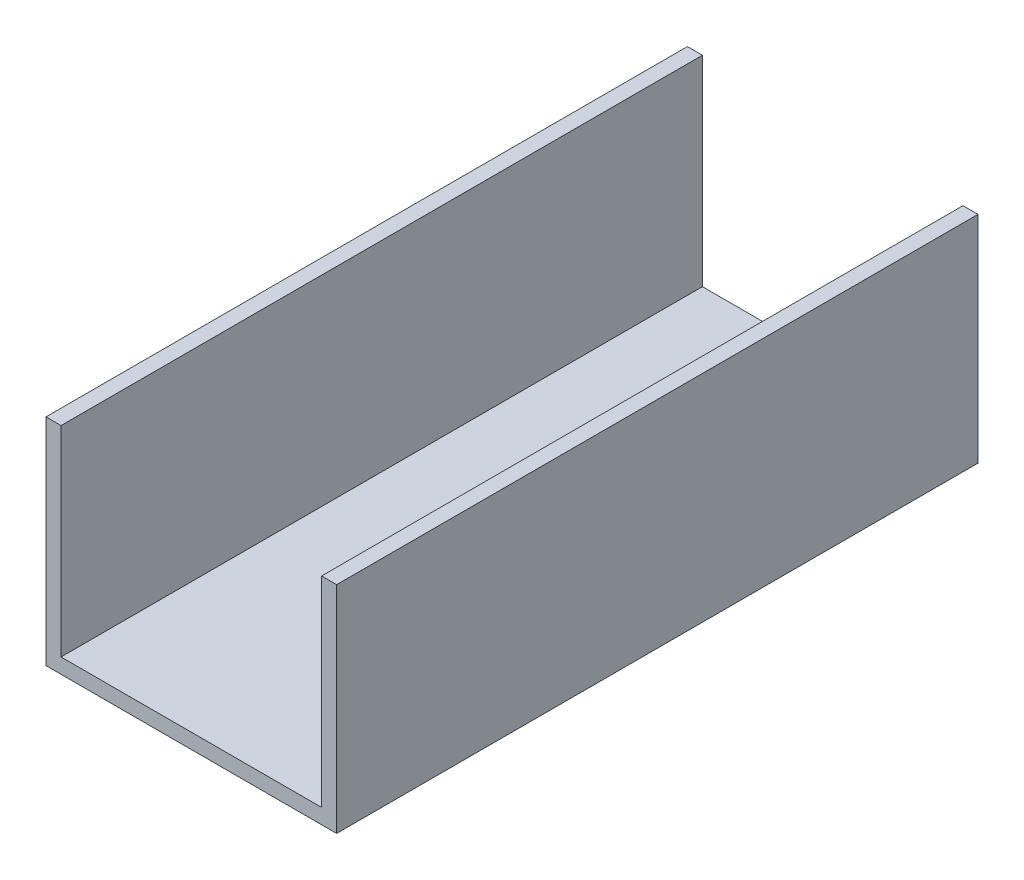
ISO-10303-21;
HEADER;
FILE_DESCRIPTION(('STEP AP214'),'2;1');
FILE_NAME('part.step','',(''),(''),'','','');
FILE_SCHEMA(('AUTOMOTIVE_DESIGN { 1 0 10303 214 1 1 1 1 }'));
ENDSEC;
DATA;
#1=APPLICATION_CONTEXT('core data for automotive mechanical design processes');
#2=APPLICATION_PROTOCOL_DEFINITION('international standard','automotive_design',2000,#1);
#3=PRODUCT_CONTEXT('',#1,'mechanical');
#4=PRODUCT('Part','Part','',(#3));
#5=PRODUCT_RELATED_PRODUCT_CATEGORY('part','',(#4));
#6=PRODUCT_DEFINITION_FORMATION('','',#4);
#7=PRODUCT_DEFINITION_CONTEXT('part definition',#1,'design');
#8=PRODUCT_DEFINITION('design','',#6,#7);
#9=PRODUCT_DEFINITION_SHAPE('','',#8);
#10=(LENGTH_UNIT() NAMED_UNIT(*) SI_UNIT(.MILLI.,.METRE.));
#11=(NAMED_UNIT(*) PLANE_ANGLE_UNIT() SI_UNIT($,.RADIAN.));
#12=(NAMED_UNIT(*) SI_UNIT($,.STERADIAN.) SOLID_ANGLE_UNIT());
#13=UNCERTAINTY_MEASURE_WITH_UNIT(LENGTH_MEASURE(1.E-05),#10,'distance_accuracy_value','');
#14=(GEOMETRIC_REPRESENTATION_CONTEXT(3) GLOBAL_UNCERTAINTY_ASSIGNED_CONTEXT((#13)) GLOBAL_UNIT_ASSIGNED_CONTEXT((#10,
#11,#12)) REPRESENTATION_CONTEXT('',''));
#15=CARTESIAN_POINT('',(0.,0.,0.));
#16=DIRECTION('',(0.,0.,1.));
#17=DIRECTION('',(1.,0.,0.));
#18=AXIS2_PLACEMENT_3D('',#15,#16,#17);
#19=CARTESIAN_POINT('',(0.,0.,203.2));
#20=DIRECTION('',(1.,0.,0.));
#21=DIRECTION('',(0.,1.,0.));
#22=AXIS2_PLACEMENT_3D('',#19,#20,#21);
#23=PLANE('',#22);
#24=DIRECTION('',(0.,-1.,0.));
#25=VECTOR('',#24,1.);
#26=CARTESIAN_POINT('',(0.,0.,0.));
#27=LINE('',#26,#25);
#28=CARTESIAN_POINT('',(0.,68.2625,0.));
#29=VERTEX_POINT('',#28);
#30=CARTESIAN_POINT('',(0.,0.,0.));
#31=VERTEX_POINT('',#30);
#32=EDGE_CURVE('E134',#29,#31,#27,.T.);
#33=ORIENTED_EDGE('',*,*,#32,.T.);
#34=DIRECTION('',(0.,0.,-1.));
#35=VECTOR('',#34,1.);
#36=CARTESIAN_POINT('',(0.,0.,203.2));
#37=LINE('',#36,#35);
#38=CARTESIAN_POINT('',(0.,0.,203.2));
#39=VERTEX_POINT('',#38);
#40=EDGE_CURVE('E11',#39,#31,#37,.T.);
#41=ORIENTED_EDGE('',*,*,#40,.F.);
#42=DIRECTION('',(0.,-1.,0.));
#43=VECTOR('',#42,1.);
#44=CARTESIAN_POINT('',(0.,0.,203.2));
#45=LINE('',#44,#43);
#46=CARTESIAN_POINT('',(0.,68.2625,203.2));
#47=VERTEX_POINT('',#46);
#48=EDGE_CURVE('E146',#47,#39,#45,.T.);
#49=ORIENTED_EDGE('',*,*,#48,.F.);
#50=DIRECTION('',(0.,0.,-1.));
#51=VECTOR('',#50,1.);
#52=CARTESIAN_POINT('',(0.,68.2625,203.2));
#53=LINE('',#52,#51);
#54=EDGE_CURVE('E131',#47,#29,#53,.T.);
#55=ORIENTED_EDGE('',*,*,#54,.T.);
#56=EDGE_LOOP('',(#33,#41,#49,#55));
#57=FACE_BOUND('',#56,.T.);
#58=ADVANCED_FACE('F39',(#57),#23,.F.);
#59=CARTESIAN_POINT('',(0.,0.,203.2));
#60=DIRECTION('',(0.,1.,0.));
#61=DIRECTION('',(0.,0.,1.));
#62=AXIS2_PLACEMENT_3D('',#59,#60,#61);
#63=PLANE('',#62);
#64=DIRECTION('',(1.,0.,0.));
#65=VECTOR('',#64,1.);
#66=CARTESIAN_POINT('',(0.,0.,0.));
#67=LINE('',#66,#65);
#68=CARTESIAN_POINT('',(92.075,0.,0.));
#69=VERTEX_POINT('',#68);
#70=EDGE_CURVE('E138',#31,#69,#67,.T.);
#71=ORIENTED_EDGE('',*,*,#70,.T.);
#72=DIRECTION('',(0.,0.,-1.));
#73=VECTOR('',#72,1.);
#74=CARTESIAN_POINT('',(92.075,0.,203.2));
#75=LINE('',#74,#73);
#76=CARTESIAN_POINT('',(92.075,0.,203.2));
#77=VERTEX_POINT('',#76);
#78=EDGE_CURVE('E50',#77,#69,#75,.T.);
#79=ORIENTED_EDGE('',*,*,#78,.F.);
#80=DIRECTION('',(1.,0.,0.));
#81=VECTOR('',#80,1.);
#82=CARTESIAN_POINT('',(0.,0.,203.2));
#83=LINE('',#82,#81);
#84=EDGE_CURVE('E97',#39,#77,#83,.T.);
#85=ORIENTED_EDGE('',*,*,#84,.F.);
#86=ORIENTED_EDGE('',*,*,#40,.T.);
#87=EDGE_LOOP('',(#71,#79,#85,#86));
#88=FACE_BOUND('',#87,.T.);
#89=ADVANCED_FACE('F182',(#88),#63,.F.);
#90=CARTESIAN_POINT('',(92.075,0.,203.2));
#91=DIRECTION('',(-1.,0.,0.));
#92=DIRECTION('',(0.,0.,1.));
#93=AXIS2_PLACEMENT_3D('',#90,#91,#92);
#94=PLANE('',#93);
#95=DIRECTION('',(0.,1.,0.));
#96=VECTOR('',#95,1.);
#97=CARTESIAN_POINT('',(92.075,0.,0.));
#98=LINE('',#97,#96);
#99=CARTESIAN_POINT('',(92.075,68.2625,0.));
#100=VERTEX_POINT('',#99);
#101=EDGE_CURVE('E139',#69,#100,#98,.T.);
#102=ORIENTED_EDGE('',*,*,#101,.T.);
#103=DIRECTION('',(0.,0.,-1.));
#104=VECTOR('',#103,1.);
#105=CARTESIAN_POINT('',(92.075,68.2625,203.2));
#106=LINE('',#105,#104);
#107=CARTESIAN_POINT('',(92.075,68.2625,203.2));
#108=VERTEX_POINT('',#107);
#109=EDGE_CURVE('E157',#108,#100,#106,.T.);
#110=ORIENTED_EDGE('',*,*,#109,.F.);
#111=DIRECTION('',(0.,1.,0.));
#112=VECTOR('',#111,1.);
#113=CARTESIAN_POINT('',(92.075,0.,203.2));
#114=LINE('',#113,#112);
#115=EDGE_CURVE('E163',#77,#108,#114,.T.);
#116=ORIENTED_EDGE('',*,*,#115,.F.);
#117=ORIENTED_EDGE('',*,*,#78,.T.);
#118=EDGE_LOOP('',(#102,#110,#116,#117));
#119=FACE_BOUND('',#118,.T.);
#120=ADVANCED_FACE('F162',(#119),#94,.F.);
#121=CARTESIAN_POINT('',(87.3125,68.2625,203.2));
#122=DIRECTION('',(0.,-1.,0.));
#123=DIRECTION('',(0.,0.,-1.));
#124=AXIS2_PLACEMENT_3D('',#121,#122,#123);
#125=PLANE('',#124);
#126=DIRECTION('',(-1.,0.,0.));
#127=VECTOR('',#126,1.);
#128=CARTESIAN_POINT('',(87.3125,68.2625,0.));
#129=LINE('',#128,#127);
#130=CARTESIAN_POINT('',(87.3125,68.2625,0.));
#131=VERTEX_POINT('',#130);
#132=EDGE_CURVE('E145',#100,#131,#129,.T.);
#133=ORIENTED_EDGE('',*,*,#132,.T.);
#134=DIRECTION('',(0.,0.,-1.));
#135=VECTOR('',#134,1.);
#136=CARTESIAN_POINT('',(87.3125,68.2625,203.2));
#137=LINE('',#136,#135);
#138=CARTESIAN_POINT('',(87.3125,68.2625,203.2));
#139=VERTEX_POINT('',#138);
#140=EDGE_CURVE('E154',#139,#131,#137,.T.);
#141=ORIENTED_EDGE('',*,*,#140,.F.);
#142=DIRECTION('',(-1.,0.,0.));
#143=VECTOR('',#142,1.);
#144=CARTESIAN_POINT('',(87.3125,68.2625,203.2));
#145=LINE('',#144,#143);
#146=EDGE_CURVE('E176',#108,#139,#145,.T.);
#147=ORIENTED_EDGE('',*,*,#146,.F.);
#148=ORIENTED_EDGE('',*,*,#109,.T.);
#149=EDGE_LOOP('',(#133,#141,#147,#148));
#150=FACE_BOUND('',#149,.T.);
#151=ADVANCED_FACE('F175',(#150),#125,.F.);
#152=CARTESIAN_POINT('',(87.3125,68.2625,203.2));
#153=DIRECTION('',(1.,0.,0.));
#154=DIRECTION('',(0.,1.,0.));
#155=AXIS2_PLACEMENT_3D('',#152,#153,#154);
#156=PLANE('',#155);
#157=DIRECTION('',(0.,-1.,0.));
#158=VECTOR('',#157,1.);
#159=CARTESIAN_POINT('',(87.3125,68.2625,0.));
#160=LINE('',#159,#158);
#161=CARTESIAN_POINT('',(87.3125,4.7625,0.));
#162=VERTEX_POINT('',#161);
#163=EDGE_CURVE('E143',#131,#162,#160,.T.);
#164=ORIENTED_EDGE('',*,*,#163,.T.);
#165=DIRECTION('',(0.,0.,-1.));
#166=VECTOR('',#165,1.);
#167=CARTESIAN_POINT('',(87.3125,4.7625,203.2));
#168=LINE('',#167,#166);
#169=CARTESIAN_POINT('',(87.3125,4.7625,203.2));
#170=VERTEX_POINT('',#169);
#171=EDGE_CURVE('E128',#170,#162,#168,.T.);
#172=ORIENTED_EDGE('',*,*,#171,.F.);
#173=DIRECTION('',(0.,-1.,0.));
#174=VECTOR('',#173,1.);
#175=CARTESIAN_POINT('',(87.3125,68.2625,203.2));
#176=LINE('',#175,#174);
#177=EDGE_CURVE('E117',#139,#170,#176,.T.);
#178=ORIENTED_EDGE('',*,*,#177,.F.);
#179=ORIENTED_EDGE('',*,*,#140,.T.);
#180=EDGE_LOOP('',(#164,#172,#178,#179));
#181=FACE_BOUND('',#180,.T.);
#182=ADVANCED_FACE('F172',(#181),#156,.F.);
#183=CARTESIAN_POINT('',(4.7625,4.7625,203.2));
#184=DIRECTION('',(0.,-1.,0.));
#185=DIRECTION('',(0.,0.,-1.));
#186=AXIS2_PLACEMENT_3D('',#183,#184,#185);
#187=PLANE('',#186);
#188=DIRECTION('',(-1.,0.,0.));
#189=VECTOR('',#188,1.);
#190=CARTESIAN_POINT('',(4.7625,4.7625,0.));
#191=LINE('',#190,#189);
#192=CARTESIAN_POINT('',(4.7625,4.7625,0.));
#193=VERTEX_POINT('',#192);
#194=EDGE_CURVE('E124',#162,#193,#191,.T.);
#195=ORIENTED_EDGE('',*,*,#194,.T.);
#196=DIRECTION('',(0.,0.,-1.));
#197=VECTOR('',#196,1.);
#198=CARTESIAN_POINT('',(4.7625,4.7625,203.2));
#199=LINE('',#198,#197);
#200=CARTESIAN_POINT('',(4.7625,4.7625,203.2));
#201=VERTEX_POINT('',#200);
#202=EDGE_CURVE('E122',#201,#193,#199,.T.);
#203=ORIENTED_EDGE('',*,*,#202,.F.);
#204=DIRECTION('',(-1.,0.,0.));
#205=VECTOR('',#204,1.);
#206=CARTESIAN_POINT('',(4.7625,4.7625,203.2));
#207=LINE('',#206,#205);
#208=EDGE_CURVE('E112',#170,#201,#207,.T.);
#209=ORIENTED_EDGE('',*,*,#208,.F.);
#210=ORIENTED_EDGE('',*,*,#171,.T.);
#211=EDGE_LOOP('',(#195,#203,#209,#210));
#212=FACE_BOUND('',#211,.T.);
#213=ADVANCED_FACE('F121',(#212),#187,.F.);
#214=CARTESIAN_POINT('',(4.76249999999999,68.2625,203.2));
#215=DIRECTION('',(-1.,0.,0.));
#216=DIRECTION('',(0.,-1.,0.));
#217=AXIS2_PLACEMENT_3D('',#214,#215,#216);
#218=PLANE('',#217);
#219=DIRECTION('',(0.,1.,0.));
#220=VECTOR('',#219,1.);
#221=CARTESIAN_POINT('',(4.76249999999999,68.2625,0.));
#222=LINE('',#221,#220);
#223=CARTESIAN_POINT('',(4.76249999999999,68.2625,0.));
#224=VERTEX_POINT('',#223);
#225=EDGE_CURVE('E84',#193,#224,#222,.T.);
#226=ORIENTED_EDGE('',*,*,#225,.T.);
#227=DIRECTION('',(0.,0.,-1.));
#228=VECTOR('',#227,1.);
#229=CARTESIAN_POINT('',(4.76249999999999,68.2625,203.2));
#230=LINE('',#229,#228);
#231=CARTESIAN_POINT('',(4.76249999999999,68.2625,203.2));
#232=VERTEX_POINT('',#231);
#233=EDGE_CURVE('E130',#232,#224,#230,.T.);
#234=ORIENTED_EDGE('',*,*,#233,.F.);
#235=DIRECTION('',(0.,1.,0.));
#236=VECTOR('',#235,1.);
#237=CARTESIAN_POINT('',(4.76249999999999,68.2625,203.2));
#238=LINE('',#237,#236);
#239=EDGE_CURVE('E113',#201,#232,#238,.T.);
#240=ORIENTED_EDGE('',*,*,#239,.F.);
#241=ORIENTED_EDGE('',*,*,#202,.T.);
#242=EDGE_LOOP('',(#226,#234,#240,#241));
#243=FACE_BOUND('',#242,.T.);
#244=ADVANCED_FACE('F129',(#243),#218,.F.);
#245=CARTESIAN_POINT('',(0.,68.2625,203.2));
#246=DIRECTION('',(0.,-1.,0.));
#247=DIRECTION('',(0.,0.,-1.));
#248=AXIS2_PLACEMENT_3D('',#245,#246,#247);
#249=PLANE('',#248);
#250=DIRECTION('',(-1.,0.,0.));
#251=VECTOR('',#250,1.);
#252=CARTESIAN_POINT('',(0.,68.2625,0.));
#253=LINE('',#252,#251);
#254=EDGE_CURVE('E89',#224,#29,#253,.T.);
#255=ORIENTED_EDGE('',*,*,#254,.T.);
#256=ORIENTED_EDGE('',*,*,#54,.F.);
#257=DIRECTION('',(-1.,0.,0.));
#258=VECTOR('',#257,1.);
#259=CARTESIAN_POINT('',(0.,68.2625,203.2));
#260=LINE('',#259,#258);
#261=EDGE_CURVE('E54',#232,#47,#260,.T.);
#262=ORIENTED_EDGE('',*,*,#261,.F.);
#263=ORIENTED_EDGE('',*,*,#233,.T.);
#264=EDGE_LOOP('',(#255,#256,#262,#263));
#265=FACE_BOUND('',#264,.T.);
#266=ADVANCED_FACE('F200',(#265),#249,.F.);
#267=CARTESIAN_POINT('',(0.,0.,203.2));
#268=DIRECTION('',(0.,0.,-1.));
#269=DIRECTION('',(-1.,0.,0.));
#270=AXIS2_PLACEMENT_3D('',#267,#268,#269);
#271=PLANE('',#270);
#272=ORIENTED_EDGE('',*,*,#48,.T.);
#273=ORIENTED_EDGE('',*,*,#84,.T.);
#274=ORIENTED_EDGE('',*,*,#115,.T.);
#275=ORIENTED_EDGE('',*,*,#146,.T.);
#276=ORIENTED_EDGE('',*,*,#177,.T.);
#277=ORIENTED_EDGE('',*,*,#208,.T.);
#278=ORIENTED_EDGE('',*,*,#239,.T.);
#279=ORIENTED_EDGE('',*,*,#261,.T.);
#280=EDGE_LOOP('',(#272,#273,#274,#275,#276,#277,#278,#279));
#281=FACE_BOUND('',#280,.T.);
#282=ADVANCED_FACE('F111',(#281),#271,.F.);
#283=CARTESIAN_POINT('',(0.,0.,0.));
#284=DIRECTION('',(0.,0.,-1.));
#285=DIRECTION('',(-1.,0.,0.));
#286=AXIS2_PLACEMENT_3D('',#283,#284,#285);
#287=PLANE('',#286);
#288=ORIENTED_EDGE('',*,*,#32,.F.);
#289=ORIENTED_EDGE('',*,*,#254,.F.);
#290=ORIENTED_EDGE('',*,*,#225,.F.);
#291=ORIENTED_EDGE('',*,*,#194,.F.);
#292=ORIENTED_EDGE('',*,*,#163,.F.);
#293=ORIENTED_EDGE('',*,*,#132,.F.);
#294=ORIENTED_EDGE('',*,*,#101,.F.);
#295=ORIENTED_EDGE('',*,*,#70,.F.);
#296=EDGE_LOOP('',(#288,#289,#290,#291,#292,#293,#294,#295));
#297=FACE_BOUND('',#296,.T.);
#298=ADVANCED_FACE('F166',(#297),#287,.T.);
#299=CLOSED_SHELL('',(#58,#89,#120,#151,#182,#213,#244,#266,#282,#298));
#300=MANIFOLD_SOLID_BREP('B2',#299);
#301=ADVANCED_BREP_SHAPE_REPRESENTATION('',(#18,#300),#14);
#302=SHAPE_DEFINITION_REPRESENTATION(#9,#301);
ENDSEC;
END-ISO-10303-21;
